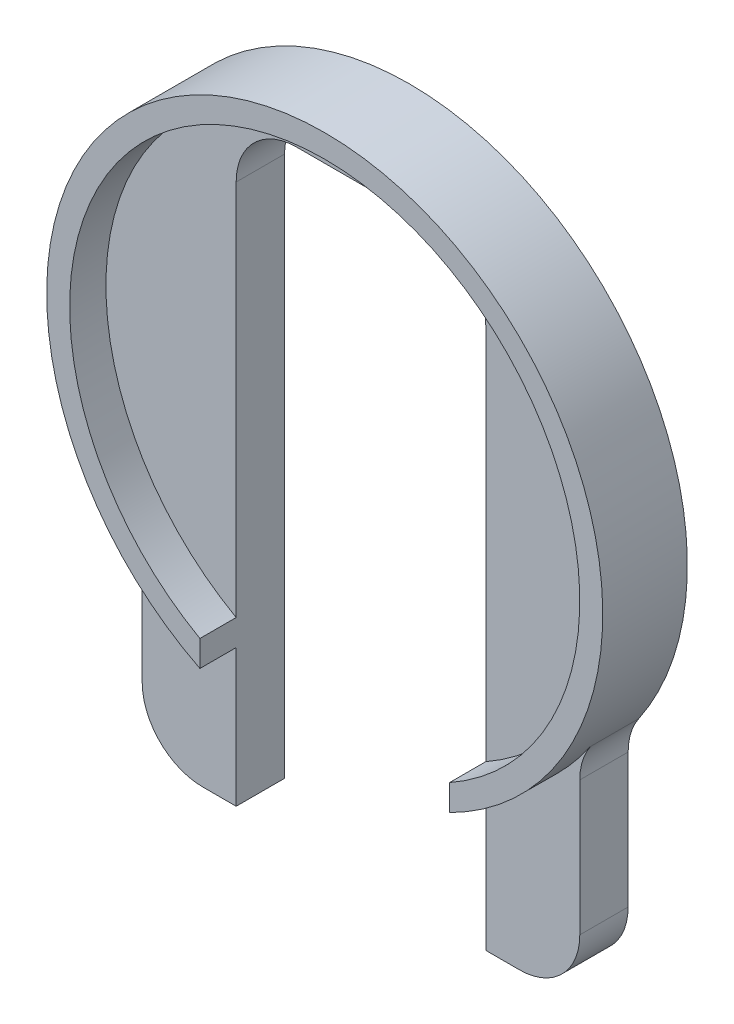
ISO-10303-21;
HEADER;
FILE_DESCRIPTION(('STEP AP214'),'2;1');
FILE_NAME('part.step','',(''),(''),'','','');
FILE_SCHEMA(('AUTOMOTIVE_DESIGN { 1 0 10303 214 1 1 1 1 }'));
ENDSEC;
DATA;
#1=APPLICATION_CONTEXT('core data for automotive mechanical design processes');
#2=APPLICATION_PROTOCOL_DEFINITION('international standard','automotive_design',2000,#1);
#3=PRODUCT_CONTEXT('',#1,'mechanical');
#4=PRODUCT('Part','Part','',(#3));
#5=PRODUCT_RELATED_PRODUCT_CATEGORY('part','',(#4));
#6=PRODUCT_DEFINITION_FORMATION('','',#4);
#7=PRODUCT_DEFINITION_CONTEXT('part definition',#1,'design');
#8=PRODUCT_DEFINITION('design','',#6,#7);
#9=PRODUCT_DEFINITION_SHAPE('','',#8);
#10=(LENGTH_UNIT() NAMED_UNIT(*) SI_UNIT(.MILLI.,.METRE.));
#11=(NAMED_UNIT(*) PLANE_ANGLE_UNIT() SI_UNIT($,.RADIAN.));
#12=(NAMED_UNIT(*) SI_UNIT($,.STERADIAN.) SOLID_ANGLE_UNIT());
#13=UNCERTAINTY_MEASURE_WITH_UNIT(LENGTH_MEASURE(1.E-05),#10,'distance_accuracy_value','');
#14=(GEOMETRIC_REPRESENTATION_CONTEXT(3) GLOBAL_UNCERTAINTY_ASSIGNED_CONTEXT((#13)) GLOBAL_UNIT_ASSIGNED_CONTEXT((#10,
#11,#12)) REPRESENTATION_CONTEXT('',''));
#15=CARTESIAN_POINT('',(0.,0.,0.));
#16=DIRECTION('',(0.,0.,1.));
#17=DIRECTION('',(1.,0.,0.));
#18=AXIS2_PLACEMENT_3D('',#15,#16,#17);
#19=CARTESIAN_POINT('',(0.,0.,4.));
#20=DIRECTION('',(0.,0.,1.));
#21=DIRECTION('',(1.,0.,0.));
#22=AXIS2_PLACEMENT_3D('',#19,#20,#21);
#23=PLANE('',#22);
#24=DIRECTION('',(1.,0.,0.));
#25=VECTOR('',#24,1.);
#26=CARTESIAN_POINT('',(10.325,-31.925,4.));
#27=LINE('',#26,#25);
#28=CARTESIAN_POINT('',(10.325,-31.925,4.));
#29=VERTEX_POINT('',#28);
#30=CARTESIAN_POINT('',(13.1,-31.925,4.));
#31=VERTEX_POINT('',#30);
#32=EDGE_CURVE('E301',#29,#31,#27,.T.);
#33=ORIENTED_EDGE('',*,*,#32,.T.);
#34=CARTESIAN_POINT('',(13.1,-26.925,4.));
#35=DIRECTION('',(0.,0.,1.));
#36=DIRECTION('',(1.,0.,0.));
#37=AXIS2_PLACEMENT_3D('',#34,#35,#36);
#38=CIRCLE('',#37,5.);
#39=CARTESIAN_POINT('',(18.1,-26.925,4.));
#40=VERTEX_POINT('',#39);
#41=EDGE_CURVE('E254',#31,#40,#38,.T.);
#42=ORIENTED_EDGE('',*,*,#41,.T.);
#43=DIRECTION('',(0.,1.,0.));
#44=VECTOR('',#43,1.);
#45=CARTESIAN_POINT('',(18.1,-31.925,4.));
#46=LINE('',#45,#44);
#47=CARTESIAN_POINT('',(18.1,-15.8237163776402,4.));
#48=VERTEX_POINT('',#47);
#49=EDGE_CURVE('E204',#40,#48,#46,.T.);
#50=ORIENTED_EDGE('',*,*,#49,.T.);
#51=CARTESIAN_POINT('',(23.1,-15.8237163776402,4.));
#52=DIRECTION('',(0.,0.,1.));
#53=DIRECTION('',(1.,0.,0.));
#54=AXIS2_PLACEMENT_3D('',#51,#52,#53);
#55=CIRCLE('',#54,5.);
#56=CARTESIAN_POINT('',(18.975,-12.9980527387759,4.));
#57=VERTEX_POINT('',#56);
#58=EDGE_CURVE('E11',#48,#57,#55,.F.);
#59=ORIENTED_EDGE('',*,*,#58,.T.);
#60=CARTESIAN_POINT('',(0.,0.,4.));
#61=DIRECTION('',(0.,0.,1.));
#62=DIRECTION('',(1.,0.,0.));
#63=AXIS2_PLACEMENT_3D('',#60,#61,#62);
#64=CIRCLE('',#63,23.);
#65=CARTESIAN_POINT('',(10.325,-20.5522352798911,4.));
#66=VERTEX_POINT('',#65);
#67=EDGE_CURVE('E56',#66,#57,#64,.T.);
#68=ORIENTED_EDGE('',*,*,#67,.F.);
#69=DIRECTION('',(0.,-1.,0.));
#70=VECTOR('',#69,1.);
#71=CARTESIAN_POINT('',(10.325,10.325,4.));
#72=LINE('',#71,#70);
#73=EDGE_CURVE('E298',#66,#29,#72,.T.);
#74=ORIENTED_EDGE('',*,*,#73,.T.);
#75=EDGE_LOOP('',(#33,#42,#50,#59,#68,#74));
#76=FACE_BOUND('',#75,.T.);
#77=ADVANCED_FACE('F33',(#76),#23,.T.);
#78=DIRECTION('',(0.,-1.,0.));
#79=VECTOR('',#78,1.);
#80=CARTESIAN_POINT('',(-18.1,-31.925,4.));
#81=LINE('',#80,#79);
#82=CARTESIAN_POINT('',(-18.1,-15.8237163776402,4.));
#83=VERTEX_POINT('',#82);
#84=CARTESIAN_POINT('',(-18.1,-26.925,4.));
#85=VERTEX_POINT('',#84);
#86=EDGE_CURVE('E199',#83,#85,#81,.T.);
#87=ORIENTED_EDGE('',*,*,#86,.T.);
#88=CARTESIAN_POINT('',(-13.1,-26.925,4.));
#89=DIRECTION('',(0.,0.,1.));
#90=DIRECTION('',(1.,0.,0.));
#91=AXIS2_PLACEMENT_3D('',#88,#89,#90);
#92=CIRCLE('',#91,5.);
#93=CARTESIAN_POINT('',(-13.1,-31.925,4.));
#94=VERTEX_POINT('',#93);
#95=EDGE_CURVE('E212',#85,#94,#92,.T.);
#96=ORIENTED_EDGE('',*,*,#95,.T.);
#97=DIRECTION('',(1.,0.,0.));
#98=VECTOR('',#97,1.);
#99=CARTESIAN_POINT('',(-10.325,-31.925,4.));
#100=LINE('',#99,#98);
#101=CARTESIAN_POINT('',(-10.325,-31.925,4.));
#102=VERTEX_POINT('',#101);
#103=EDGE_CURVE('E203',#94,#102,#100,.T.);
#104=ORIENTED_EDGE('',*,*,#103,.T.);
#105=DIRECTION('',(0.,1.,0.));
#106=VECTOR('',#105,1.);
#107=CARTESIAN_POINT('',(-10.325,10.325,4.));
#108=LINE('',#107,#106);
#109=CARTESIAN_POINT('',(-10.325,-20.5522352798911,4.));
#110=VERTEX_POINT('',#109);
#111=EDGE_CURVE('E285',#102,#110,#108,.T.);
#112=ORIENTED_EDGE('',*,*,#111,.T.);
#113=CARTESIAN_POINT('',(-18.975,-12.9980527387759,4.));
#114=VERTEX_POINT('',#113);
#115=EDGE_CURVE('E48',#114,#110,#64,.T.);
#116=ORIENTED_EDGE('',*,*,#115,.F.);
#117=CARTESIAN_POINT('',(-23.1,-15.8237163776402,4.));
#118=DIRECTION('',(0.,0.,1.));
#119=DIRECTION('',(1.,0.,0.));
#120=AXIS2_PLACEMENT_3D('',#117,#118,#119);
#121=CIRCLE('',#120,5.);
#122=EDGE_CURVE('E220',#114,#83,#121,.F.);
#123=ORIENTED_EDGE('',*,*,#122,.T.);
#124=EDGE_LOOP('',(#87,#96,#104,#112,#116,#123));
#125=FACE_BOUND('',#124,.T.);
#126=ADVANCED_FACE('F370',(#125),#23,.T.);
#127=CARTESIAN_POINT('',(-10.325,17.8,4.));
#128=DIRECTION('',(0.,1.,0.));
#129=DIRECTION('',(-1.,0.,0.));
#130=AXIS2_PLACEMENT_3D('',#127,#128,#129);
#131=PLANE('',#130);
#132=DIRECTION('',(1.,0.,0.));
#133=VECTOR('',#132,1.);
#134=CARTESIAN_POINT('',(-10.325,17.8,0.));
#135=LINE('',#134,#133);
#136=CARTESIAN_POINT('',(-5.325,17.8,0.));
#137=VERTEX_POINT('',#136);
#138=CARTESIAN_POINT('',(5.325,17.8,0.));
#139=VERTEX_POINT('',#138);
#140=EDGE_CURVE('E182',#137,#139,#135,.T.);
#141=ORIENTED_EDGE('',*,*,#140,.T.);
#142=DIRECTION('',(0.,0.,-1.));
#143=VECTOR('',#142,1.);
#144=CARTESIAN_POINT('',(5.325,17.8,4.));
#145=LINE('',#144,#143);
#146=CARTESIAN_POINT('',(5.325,17.8,4.));
#147=VERTEX_POINT('',#146);
#148=EDGE_CURVE('E316',#139,#147,#145,.F.);
#149=ORIENTED_EDGE('',*,*,#148,.T.);
#150=DIRECTION('',(1.,0.,0.));
#151=VECTOR('',#150,1.);
#152=CARTESIAN_POINT('',(-10.325,17.8,4.));
#153=LINE('',#152,#151);
#154=CARTESIAN_POINT('',(-5.325,17.8,4.));
#155=VERTEX_POINT('',#154);
#156=EDGE_CURVE('E288',#155,#147,#153,.T.);
#157=ORIENTED_EDGE('',*,*,#156,.F.);
#158=DIRECTION('',(0.,0.,-1.));
#159=VECTOR('',#158,1.);
#160=CARTESIAN_POINT('',(-5.325,17.8,0.));
#161=LINE('',#160,#159);
#162=EDGE_CURVE('E313',#155,#137,#161,.T.);
#163=ORIENTED_EDGE('',*,*,#162,.T.);
#164=EDGE_LOOP('',(#141,#149,#157,#163));
#165=FACE_BOUND('',#164,.T.);
#166=ADVANCED_FACE('F336',(#165),#131,.F.);
#167=CARTESIAN_POINT('',(10.325,10.325,4.));
#168=DIRECTION('',(1.,0.,0.));
#169=DIRECTION('',(0.,0.,-1.));
#170=AXIS2_PLACEMENT_3D('',#167,#168,#169);
#171=PLANE('',#170);
#172=CARTESIAN_POINT('',(10.325,12.8,4.));
#173=VERTEX_POINT('',#172);
#174=CARTESIAN_POINT('',(10.325,-18.4012058028815,4.));
#175=VERTEX_POINT('',#174);
#176=EDGE_CURVE('E306',#173,#175,#72,.T.);
#177=ORIENTED_EDGE('',*,*,#176,.F.);
#178=DIRECTION('',(0.,0.,-1.));
#179=VECTOR('',#178,1.);
#180=CARTESIAN_POINT('',(10.325,12.8,0.));
#181=LINE('',#180,#179);
#182=CARTESIAN_POINT('',(10.325,12.8,0.));
#183=VERTEX_POINT('',#182);
#184=EDGE_CURVE('E310',#173,#183,#181,.T.);
#185=ORIENTED_EDGE('',*,*,#184,.T.);
#186=DIRECTION('',(0.,-1.,0.));
#187=VECTOR('',#186,1.);
#188=CARTESIAN_POINT('',(10.325,10.325,0.));
#189=LINE('',#188,#187);
#190=CARTESIAN_POINT('',(10.325,-31.925,0.));
#191=VERTEX_POINT('',#190);
#192=EDGE_CURVE('E185',#183,#191,#189,.T.);
#193=ORIENTED_EDGE('',*,*,#192,.T.);
#194=DIRECTION('',(0.,0.,-1.));
#195=VECTOR('',#194,1.);
#196=CARTESIAN_POINT('',(10.325,-31.925,4.));
#197=LINE('',#196,#195);
#198=EDGE_CURVE('E282',#29,#191,#197,.T.);
#199=ORIENTED_EDGE('',*,*,#198,.F.);
#200=ORIENTED_EDGE('',*,*,#73,.F.);
#201=DIRECTION('',(0.,0.,-1.));
#202=VECTOR('',#201,1.);
#203=CARTESIAN_POINT('',(10.325,-20.5522352798911,7.));
#204=LINE('',#203,#202);
#205=CARTESIAN_POINT('',(10.325,-20.5522352798911,7.));
#206=VERTEX_POINT('',#205);
#207=EDGE_CURVE('E349',#206,#66,#204,.T.);
#208=ORIENTED_EDGE('',*,*,#207,.F.);
#209=DIRECTION('',(0.,-1.,0.));
#210=VECTOR('',#209,1.);
#211=CARTESIAN_POINT('',(10.325,-18.4012058028815,7.));
#212=LINE('',#211,#210);
#213=CARTESIAN_POINT('',(10.325,-18.4012058028815,7.));
#214=VERTEX_POINT('',#213);
#215=EDGE_CURVE('E176',#214,#206,#212,.T.);
#216=ORIENTED_EDGE('',*,*,#215,.F.);
#217=DIRECTION('',(0.,0.,-1.));
#218=VECTOR('',#217,1.);
#219=CARTESIAN_POINT('',(10.325,-18.4012058028815,7.));
#220=LINE('',#219,#218);
#221=EDGE_CURVE('E187',#214,#175,#220,.T.);
#222=ORIENTED_EDGE('',*,*,#221,.T.);
#223=EDGE_LOOP('',(#177,#185,#193,#199,#200,#208,#216,#222));
#224=FACE_BOUND('',#223,.T.);
#225=ADVANCED_FACE('F345',(#224),#171,.F.);
#226=CARTESIAN_POINT('',(10.325,-31.925,4.));
#227=DIRECTION('',(0.,1.,0.));
#228=DIRECTION('',(-1.,0.,0.));
#229=AXIS2_PLACEMENT_3D('',#226,#227,#228);
#230=PLANE('',#229);
#231=DIRECTION('',(1.,0.,0.));
#232=VECTOR('',#231,1.);
#233=CARTESIAN_POINT('',(10.325,-31.925,0.));
#234=LINE('',#233,#232);
#235=CARTESIAN_POINT('',(13.1,-31.925,0.));
#236=VERTEX_POINT('',#235);
#237=EDGE_CURVE('E239',#191,#236,#234,.T.);
#238=ORIENTED_EDGE('',*,*,#237,.T.);
#239=DIRECTION('',(0.,0.,-1.));
#240=VECTOR('',#239,1.);
#241=CARTESIAN_POINT('',(13.1,-31.925,4.));
#242=LINE('',#241,#240);
#243=EDGE_CURVE('E253',#236,#31,#242,.F.);
#244=ORIENTED_EDGE('',*,*,#243,.T.);
#245=ORIENTED_EDGE('',*,*,#32,.F.);
#246=ORIENTED_EDGE('',*,*,#198,.T.);
#247=EDGE_LOOP('',(#238,#244,#245,#246));
#248=FACE_BOUND('',#247,.T.);
#249=ADVANCED_FACE('F392',(#248),#230,.F.);
#250=CARTESIAN_POINT('',(18.1,-31.925,4.));
#251=DIRECTION('',(-1.,0.,0.));
#252=DIRECTION('',(0.,0.,1.));
#253=AXIS2_PLACEMENT_3D('',#250,#251,#252);
#254=PLANE('',#253);
#255=ORIENTED_EDGE('',*,*,#49,.F.);
#256=DIRECTION('',(0.,0.,-1.));
#257=VECTOR('',#256,1.);
#258=CARTESIAN_POINT('',(18.1,-26.925,4.));
#259=LINE('',#258,#257);
#260=CARTESIAN_POINT('',(18.1,-26.925,0.));
#261=VERTEX_POINT('',#260);
#262=EDGE_CURVE('E238',#40,#261,#259,.T.);
#263=ORIENTED_EDGE('',*,*,#262,.T.);
#264=DIRECTION('',(0.,1.,0.));
#265=VECTOR('',#264,1.);
#266=CARTESIAN_POINT('',(18.1,-31.925,0.));
#267=LINE('',#266,#265);
#268=CARTESIAN_POINT('',(18.1,-15.8237163776402,0.));
#269=VERTEX_POINT('',#268);
#270=EDGE_CURVE('E226',#261,#269,#267,.T.);
#271=ORIENTED_EDGE('',*,*,#270,.T.);
#272=DIRECTION('',(0.,0.,1.));
#273=VECTOR('',#272,1.);
#274=CARTESIAN_POINT('',(18.1,-15.8237163776402,4.));
#275=LINE('',#274,#273);
#276=EDGE_CURVE('E235',#269,#48,#275,.T.);
#277=ORIENTED_EDGE('',*,*,#276,.T.);
#278=EDGE_LOOP('',(#255,#263,#271,#277));
#279=FACE_BOUND('',#278,.T.);
#280=ADVANCED_FACE('F234',(#279),#254,.F.);
#281=CARTESIAN_POINT('',(0.,0.,4.));
#282=DIRECTION('',(0.,0.,-1.));
#283=DIRECTION('',(-1.,0.,0.));
#284=AXIS2_PLACEMENT_3D('',#281,#282,#283);
#285=CYLINDRICAL_SURFACE('',#284,23.);
#286=CARTESIAN_POINT('',(0.,0.,0.));
#287=DIRECTION('',(0.,0.,1.));
#288=DIRECTION('',(1.,0.,0.));
#289=AXIS2_PLACEMENT_3D('',#286,#287,#288);
#290=CIRCLE('',#289,23.);
#291=CARTESIAN_POINT('',(18.975,-12.9980527387759,0.));
#292=VERTEX_POINT('',#291);
#293=CARTESIAN_POINT('',(-18.975,-12.9980527387759,0.));
#294=VERTEX_POINT('',#293);
#295=EDGE_CURVE('E227',#292,#294,#290,.T.);
#296=ORIENTED_EDGE('',*,*,#295,.T.);
#297=DIRECTION('',(0.,0.,-1.));
#298=VECTOR('',#297,1.);
#299=CARTESIAN_POINT('',(-18.975,-12.9980527387759,4.));
#300=LINE('',#299,#298);
#301=EDGE_CURVE('E216',#294,#114,#300,.F.);
#302=ORIENTED_EDGE('',*,*,#301,.T.);
#303=ORIENTED_EDGE('',*,*,#115,.T.);
#304=DIRECTION('',(0.,0.,-1.));
#305=VECTOR('',#304,1.);
#306=CARTESIAN_POINT('',(-10.325,-20.5522352798911,7.));
#307=LINE('',#306,#305);
#308=CARTESIAN_POINT('',(-10.325,-20.5522352798911,7.));
#309=VERTEX_POINT('',#308);
#310=EDGE_CURVE('E164',#309,#110,#307,.T.);
#311=ORIENTED_EDGE('',*,*,#310,.F.);
#312=CARTESIAN_POINT('',(0.,0.,7.));
#313=DIRECTION('',(0.,0.,1.));
#314=DIRECTION('',(1.,0.,0.));
#315=AXIS2_PLACEMENT_3D('',#312,#313,#314);
#316=CIRCLE('',#315,23.);
#317=EDGE_CURVE('E171',#206,#309,#316,.T.);
#318=ORIENTED_EDGE('',*,*,#317,.F.);
#319=ORIENTED_EDGE('',*,*,#207,.T.);
#320=ORIENTED_EDGE('',*,*,#67,.T.);
#321=DIRECTION('',(0.,0.,-1.));
#322=VECTOR('',#321,1.);
#323=CARTESIAN_POINT('',(18.975,-12.9980527387759,4.));
#324=LINE('',#323,#322);
#325=EDGE_CURVE('E214',#57,#292,#324,.T.);
#326=ORIENTED_EDGE('',*,*,#325,.T.);
#327=EDGE_LOOP('',(#296,#302,#303,#311,#318,#319,#320,#326));
#328=FACE_BOUND('',#327,.T.);
#329=ADVANCED_FACE('F181',(#328),#285,.T.);
#330=CARTESIAN_POINT('',(-18.1,-31.925,4.));
#331=DIRECTION('',(1.,0.,0.));
#332=DIRECTION('',(0.,0.,-1.));
#333=AXIS2_PLACEMENT_3D('',#330,#331,#332);
#334=PLANE('',#333);
#335=DIRECTION('',(0.,-1.,0.));
#336=VECTOR('',#335,1.);
#337=CARTESIAN_POINT('',(-18.1,-31.925,0.));
#338=LINE('',#337,#336);
#339=CARTESIAN_POINT('',(-18.1,-15.8237163776402,0.));
#340=VERTEX_POINT('',#339);
#341=CARTESIAN_POINT('',(-18.1,-26.925,0.));
#342=VERTEX_POINT('',#341);
#343=EDGE_CURVE('E273',#340,#342,#338,.T.);
#344=ORIENTED_EDGE('',*,*,#343,.T.);
#345=DIRECTION('',(0.,0.,-1.));
#346=VECTOR('',#345,1.);
#347=CARTESIAN_POINT('',(-18.1,-26.925,4.));
#348=LINE('',#347,#346);
#349=EDGE_CURVE('E210',#342,#85,#348,.F.);
#350=ORIENTED_EDGE('',*,*,#349,.T.);
#351=ORIENTED_EDGE('',*,*,#86,.F.);
#352=DIRECTION('',(0.,0.,1.));
#353=VECTOR('',#352,1.);
#354=CARTESIAN_POINT('',(-18.1,-15.8237163776402,0.));
#355=LINE('',#354,#353);
#356=EDGE_CURVE('E207',#83,#340,#355,.F.);
#357=ORIENTED_EDGE('',*,*,#356,.T.);
#358=EDGE_LOOP('',(#344,#350,#351,#357));
#359=FACE_BOUND('',#358,.T.);
#360=ADVANCED_FACE('F382',(#359),#334,.F.);
#361=CARTESIAN_POINT('',(-10.325,-31.925,4.));
#362=DIRECTION('',(0.,1.,0.));
#363=DIRECTION('',(0.,0.,1.));
#364=AXIS2_PLACEMENT_3D('',#361,#362,#363);
#365=PLANE('',#364);
#366=ORIENTED_EDGE('',*,*,#103,.F.);
#367=DIRECTION('',(0.,0.,-1.));
#368=VECTOR('',#367,1.);
#369=CARTESIAN_POINT('',(-13.1,-31.925,4.));
#370=LINE('',#369,#368);
#371=CARTESIAN_POINT('',(-13.1,-31.925,0.));
#372=VERTEX_POINT('',#371);
#373=EDGE_CURVE('E205',#94,#372,#370,.T.);
#374=ORIENTED_EDGE('',*,*,#373,.T.);
#375=DIRECTION('',(1.,0.,0.));
#376=VECTOR('',#375,1.);
#377=CARTESIAN_POINT('',(-10.325,-31.925,0.));
#378=LINE('',#377,#376);
#379=CARTESIAN_POINT('',(-10.325,-31.925,0.));
#380=VERTEX_POINT('',#379);
#381=EDGE_CURVE('E265',#372,#380,#378,.T.);
#382=ORIENTED_EDGE('',*,*,#381,.T.);
#383=DIRECTION('',(0.,0.,-1.));
#384=VECTOR('',#383,1.);
#385=CARTESIAN_POINT('',(-10.325,-31.925,4.));
#386=LINE('',#385,#384);
#387=EDGE_CURVE('E280',#102,#380,#386,.T.);
#388=ORIENTED_EDGE('',*,*,#387,.F.);
#389=EDGE_LOOP('',(#366,#374,#382,#388));
#390=FACE_BOUND('',#389,.T.);
#391=ADVANCED_FACE('F263',(#390),#365,.F.);
#392=CARTESIAN_POINT('',(-10.325,10.325,4.));
#393=DIRECTION('',(-1.,0.,0.));
#394=DIRECTION('',(0.,0.,1.));
#395=AXIS2_PLACEMENT_3D('',#392,#393,#394);
#396=PLANE('',#395);
#397=DIRECTION('',(0.,1.,0.));
#398=VECTOR('',#397,1.);
#399=CARTESIAN_POINT('',(-10.325,10.325,0.));
#400=LINE('',#399,#398);
#401=CARTESIAN_POINT('',(-10.325,12.8,0.));
#402=VERTEX_POINT('',#401);
#403=EDGE_CURVE('E272',#380,#402,#400,.T.);
#404=ORIENTED_EDGE('',*,*,#403,.T.);
#405=DIRECTION('',(0.,0.,-1.));
#406=VECTOR('',#405,1.);
#407=CARTESIAN_POINT('',(-10.325,12.8,4.));
#408=LINE('',#407,#406);
#409=CARTESIAN_POINT('',(-10.325,12.8,4.));
#410=VERTEX_POINT('',#409);
#411=EDGE_CURVE('E318',#402,#410,#408,.F.);
#412=ORIENTED_EDGE('',*,*,#411,.T.);
#413=CARTESIAN_POINT('',(-10.325,-18.4012058028815,4.));
#414=VERTEX_POINT('',#413);
#415=EDGE_CURVE('E275',#414,#410,#108,.T.);
#416=ORIENTED_EDGE('',*,*,#415,.F.);
#417=DIRECTION('',(0.,0.,-1.));
#418=VECTOR('',#417,1.);
#419=CARTESIAN_POINT('',(-10.325,-18.4012058028815,7.));
#420=LINE('',#419,#418);
#421=CARTESIAN_POINT('',(-10.325,-18.4012058028815,7.));
#422=VERTEX_POINT('',#421);
#423=EDGE_CURVE('E167',#422,#414,#420,.T.);
#424=ORIENTED_EDGE('',*,*,#423,.F.);
#425=DIRECTION('',(0.,1.,0.));
#426=VECTOR('',#425,1.);
#427=CARTESIAN_POINT('',(-10.325,-18.4012058028815,7.));
#428=LINE('',#427,#426);
#429=EDGE_CURVE('E158',#309,#422,#428,.T.);
#430=ORIENTED_EDGE('',*,*,#429,.F.);
#431=ORIENTED_EDGE('',*,*,#310,.T.);
#432=ORIENTED_EDGE('',*,*,#111,.F.);
#433=ORIENTED_EDGE('',*,*,#387,.T.);
#434=EDGE_LOOP('',(#404,#412,#416,#424,#430,#431,#432,#433));
#435=FACE_BOUND('',#434,.T.);
#436=ADVANCED_FACE('F161',(#435),#396,.F.);
#437=CARTESIAN_POINT('',(0.,0.,4.));
#438=DIRECTION('',(0.,0.,-1.));
#439=DIRECTION('',(1.,0.,0.));
#440=AXIS2_PLACEMENT_3D('',#437,#438,#439);
#441=CIRCLE('',#440,21.1);
#442=EDGE_CURVE('E178',#414,#175,#441,.T.);
#443=ORIENTED_EDGE('',*,*,#442,.F.);
#444=ORIENTED_EDGE('',*,*,#415,.T.);
#445=CARTESIAN_POINT('',(-5.325,12.8,4.));
#446=DIRECTION('',(0.,0.,1.));
#447=DIRECTION('',(1.,0.,0.));
#448=AXIS2_PLACEMENT_3D('',#445,#446,#447);
#449=CIRCLE('',#448,5.);
#450=EDGE_CURVE('E242',#410,#155,#449,.F.);
#451=ORIENTED_EDGE('',*,*,#450,.T.);
#452=ORIENTED_EDGE('',*,*,#156,.T.);
#453=CARTESIAN_POINT('',(5.325,12.8,4.));
#454=DIRECTION('',(0.,0.,1.));
#455=DIRECTION('',(1.,0.,0.));
#456=AXIS2_PLACEMENT_3D('',#453,#454,#455);
#457=CIRCLE('',#456,5.);
#458=EDGE_CURVE('E322',#147,#173,#457,.F.);
#459=ORIENTED_EDGE('',*,*,#458,.T.);
#460=ORIENTED_EDGE('',*,*,#176,.T.);
#461=EDGE_LOOP('',(#443,#444,#451,#452,#459,#460));
#462=FACE_BOUND('',#461,.T.);
#463=ADVANCED_FACE('F333',(#462),#23,.T.);
#464=CARTESIAN_POINT('',(0.,0.,0.));
#465=DIRECTION('',(0.,0.,1.));
#466=DIRECTION('',(1.,0.,0.));
#467=AXIS2_PLACEMENT_3D('',#464,#465,#466);
#468=PLANE('',#467);
#469=ORIENTED_EDGE('',*,*,#270,.F.);
#470=CARTESIAN_POINT('',(13.1,-26.925,0.));
#471=DIRECTION('',(0.,0.,1.));
#472=DIRECTION('',(1.,0.,0.));
#473=AXIS2_PLACEMENT_3D('',#470,#471,#472);
#474=CIRCLE('',#473,5.);
#475=EDGE_CURVE('E251',#261,#236,#474,.F.);
#476=ORIENTED_EDGE('',*,*,#475,.T.);
#477=ORIENTED_EDGE('',*,*,#237,.F.);
#478=ORIENTED_EDGE('',*,*,#192,.F.);
#479=CARTESIAN_POINT('',(5.325,12.8,0.));
#480=DIRECTION('',(0.,0.,1.));
#481=DIRECTION('',(1.,0.,0.));
#482=AXIS2_PLACEMENT_3D('',#479,#480,#481);
#483=CIRCLE('',#482,5.);
#484=EDGE_CURVE('E320',#183,#139,#483,.T.);
#485=ORIENTED_EDGE('',*,*,#484,.T.);
#486=ORIENTED_EDGE('',*,*,#140,.F.);
#487=CARTESIAN_POINT('',(-5.325,12.8,0.));
#488=DIRECTION('',(0.,0.,1.));
#489=DIRECTION('',(1.,0.,0.));
#490=AXIS2_PLACEMENT_3D('',#487,#488,#489);
#491=CIRCLE('',#490,5.);
#492=EDGE_CURVE('E246',#137,#402,#491,.T.);
#493=ORIENTED_EDGE('',*,*,#492,.T.);
#494=ORIENTED_EDGE('',*,*,#403,.F.);
#495=ORIENTED_EDGE('',*,*,#381,.F.);
#496=CARTESIAN_POINT('',(-13.1,-26.925,0.));
#497=DIRECTION('',(0.,0.,1.));
#498=DIRECTION('',(1.,0.,0.));
#499=AXIS2_PLACEMENT_3D('',#496,#497,#498);
#500=CIRCLE('',#499,5.);
#501=EDGE_CURVE('E244',#372,#342,#500,.F.);
#502=ORIENTED_EDGE('',*,*,#501,.T.);
#503=ORIENTED_EDGE('',*,*,#343,.F.);
#504=CARTESIAN_POINT('',(-23.1,-15.8237163776402,0.));
#505=DIRECTION('',(0.,0.,1.));
#506=DIRECTION('',(1.,0.,0.));
#507=AXIS2_PLACEMENT_3D('',#504,#505,#506);
#508=CIRCLE('',#507,5.);
#509=EDGE_CURVE('E218',#340,#294,#508,.T.);
#510=ORIENTED_EDGE('',*,*,#509,.T.);
#511=ORIENTED_EDGE('',*,*,#295,.F.);
#512=CARTESIAN_POINT('',(23.1,-15.8237163776402,0.));
#513=DIRECTION('',(0.,0.,1.));
#514=DIRECTION('',(1.,0.,0.));
#515=AXIS2_PLACEMENT_3D('',#512,#513,#514);
#516=CIRCLE('',#515,5.);
#517=EDGE_CURVE('E41',#292,#269,#516,.T.);
#518=ORIENTED_EDGE('',*,*,#517,.T.);
#519=EDGE_LOOP('',(#469,#476,#477,#478,#485,#486,#493,#494,#495,#502,#503,#510,#511,#518));
#520=FACE_BOUND('',#519,.T.);
#521=ADVANCED_FACE('F225',(#520),#468,.F.);
#522=CARTESIAN_POINT('',(0.,0.,7.));
#523=DIRECTION('',(0.,0.,-1.));
#524=DIRECTION('',(-1.,0.,0.));
#525=AXIS2_PLACEMENT_3D('',#522,#523,#524);
#526=CYLINDRICAL_SURFACE('',#525,21.1);
#527=ORIENTED_EDGE('',*,*,#442,.T.);
#528=ORIENTED_EDGE('',*,*,#221,.F.);
#529=CARTESIAN_POINT('',(0.,0.,7.));
#530=DIRECTION('',(0.,0.,-1.));
#531=DIRECTION('',(1.,0.,0.));
#532=AXIS2_PLACEMENT_3D('',#529,#530,#531);
#533=CIRCLE('',#532,21.1);
#534=EDGE_CURVE('E170',#422,#214,#533,.T.);
#535=ORIENTED_EDGE('',*,*,#534,.F.);
#536=ORIENTED_EDGE('',*,*,#423,.T.);
#537=EDGE_LOOP('',(#527,#528,#535,#536));
#538=FACE_BOUND('',#537,.T.);
#539=ADVANCED_FACE('F359',(#538),#526,.F.);
#540=CARTESIAN_POINT('',(0.,0.,7.));
#541=DIRECTION('',(0.,0.,1.));
#542=DIRECTION('',(1.,0.,0.));
#543=AXIS2_PLACEMENT_3D('',#540,#541,#542);
#544=PLANE('',#543);
#545=ORIENTED_EDGE('',*,*,#317,.T.);
#546=ORIENTED_EDGE('',*,*,#429,.T.);
#547=ORIENTED_EDGE('',*,*,#534,.T.);
#548=ORIENTED_EDGE('',*,*,#215,.T.);
#549=EDGE_LOOP('',(#545,#546,#547,#548));
#550=FACE_BOUND('',#549,.T.);
#551=ADVANCED_FACE('F174',(#550),#544,.T.);
#552=CARTESIAN_POINT('',(5.325,12.8,4.));
#553=DIRECTION('',(0.,0.,1.));
#554=DIRECTION('',(1.,0.,0.));
#555=AXIS2_PLACEMENT_3D('',#552,#553,#554);
#556=CYLINDRICAL_SURFACE('',#555,5.);
#557=ORIENTED_EDGE('',*,*,#458,.F.);
#558=ORIENTED_EDGE('',*,*,#148,.F.);
#559=ORIENTED_EDGE('',*,*,#484,.F.);
#560=ORIENTED_EDGE('',*,*,#184,.F.);
#561=EDGE_LOOP('',(#557,#558,#559,#560));
#562=FACE_BOUND('',#561,.T.);
#563=ADVANCED_FACE('F339',(#562),#556,.F.);
#564=CARTESIAN_POINT('',(-5.325,12.8,4.));
#565=DIRECTION('',(0.,0.,1.));
#566=DIRECTION('',(1.,0.,0.));
#567=AXIS2_PLACEMENT_3D('',#564,#565,#566);
#568=CYLINDRICAL_SURFACE('',#567,5.);
#569=ORIENTED_EDGE('',*,*,#450,.F.);
#570=ORIENTED_EDGE('',*,*,#411,.F.);
#571=ORIENTED_EDGE('',*,*,#492,.F.);
#572=ORIENTED_EDGE('',*,*,#162,.F.);
#573=EDGE_LOOP('',(#569,#570,#571,#572));
#574=FACE_BOUND('',#573,.T.);
#575=ADVANCED_FACE('F330',(#574),#568,.F.);
#576=CARTESIAN_POINT('',(13.1,-26.925,4.));
#577=DIRECTION('',(0.,0.,-1.));
#578=DIRECTION('',(-1.,0.,0.));
#579=AXIS2_PLACEMENT_3D('',#576,#577,#578);
#580=CYLINDRICAL_SURFACE('',#579,5.);
#581=ORIENTED_EDGE('',*,*,#41,.F.);
#582=ORIENTED_EDGE('',*,*,#243,.F.);
#583=ORIENTED_EDGE('',*,*,#475,.F.);
#584=ORIENTED_EDGE('',*,*,#262,.F.);
#585=EDGE_LOOP('',(#581,#582,#583,#584));
#586=FACE_BOUND('',#585,.T.);
#587=ADVANCED_FACE('F404',(#586),#580,.T.);
#588=CARTESIAN_POINT('',(-13.1,-26.925,4.));
#589=DIRECTION('',(0.,0.,-1.));
#590=DIRECTION('',(-1.,0.,0.));
#591=AXIS2_PLACEMENT_3D('',#588,#589,#590);
#592=CYLINDRICAL_SURFACE('',#591,5.);
#593=ORIENTED_EDGE('',*,*,#95,.F.);
#594=ORIENTED_EDGE('',*,*,#349,.F.);
#595=ORIENTED_EDGE('',*,*,#501,.F.);
#596=ORIENTED_EDGE('',*,*,#373,.F.);
#597=EDGE_LOOP('',(#593,#594,#595,#596));
#598=FACE_BOUND('',#597,.T.);
#599=ADVANCED_FACE('F407',(#598),#592,.T.);
#600=CARTESIAN_POINT('',(-23.1,-15.8237163776402,4.));
#601=DIRECTION('',(0.,0.,-1.));
#602=DIRECTION('',(-1.,0.,0.));
#603=AXIS2_PLACEMENT_3D('',#600,#601,#602);
#604=CYLINDRICAL_SURFACE('',#603,5.);
#605=ORIENTED_EDGE('',*,*,#122,.F.);
#606=ORIENTED_EDGE('',*,*,#301,.F.);
#607=ORIENTED_EDGE('',*,*,#509,.F.);
#608=ORIENTED_EDGE('',*,*,#356,.F.);
#609=EDGE_LOOP('',(#605,#606,#607,#608));
#610=FACE_BOUND('',#609,.T.);
#611=ADVANCED_FACE('F410',(#610),#604,.F.);
#612=CARTESIAN_POINT('',(23.1,-15.8237163776402,4.));
#613=DIRECTION('',(0.,0.,-1.));
#614=DIRECTION('',(-1.,0.,0.));
#615=AXIS2_PLACEMENT_3D('',#612,#613,#614);
#616=CYLINDRICAL_SURFACE('',#615,5.);
#617=ORIENTED_EDGE('',*,*,#58,.F.);
#618=ORIENTED_EDGE('',*,*,#276,.F.);
#619=ORIENTED_EDGE('',*,*,#517,.F.);
#620=ORIENTED_EDGE('',*,*,#325,.F.);
#621=EDGE_LOOP('',(#617,#618,#619,#620));
#622=FACE_BOUND('',#621,.T.);
#623=ADVANCED_FACE('F35',(#622),#616,.F.);
#624=CLOSED_SHELL('',(#77,#126,#166,#225,#249,#280,#329,#360,#391,#436,#463,#521,#539,#551,#563,
#575,#587,#599,#611,#623));
#625=MANIFOLD_SOLID_BREP('B2',#624);
#626=ADVANCED_BREP_SHAPE_REPRESENTATION('',(#18,#625),#14);
#627=SHAPE_DEFINITION_REPRESENTATION(#9,#626);
ENDSEC;
END-ISO-10303-21;
